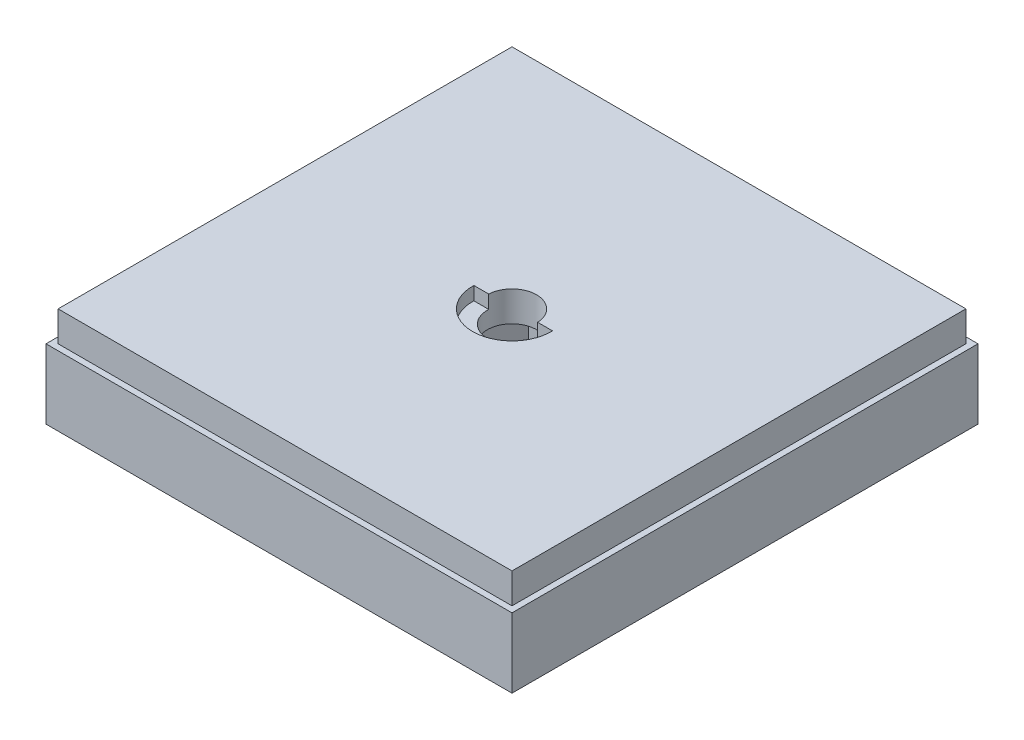
ISO-10303-21;
HEADER;
FILE_DESCRIPTION(('STEP AP214'),'2;1');
FILE_NAME('part.step','',(''),(''),'','','');
FILE_SCHEMA(('AUTOMOTIVE_DESIGN { 1 0 10303 214 1 1 1 1 }'));
ENDSEC;
DATA;
#1=APPLICATION_CONTEXT('core data for automotive mechanical design processes');
#2=APPLICATION_PROTOCOL_DEFINITION('international standard','automotive_design',2000,#1);
#3=PRODUCT_CONTEXT('',#1,'mechanical');
#4=PRODUCT('Part','Part','',(#3));
#5=PRODUCT_RELATED_PRODUCT_CATEGORY('part','',(#4));
#6=PRODUCT_DEFINITION_FORMATION('','',#4);
#7=PRODUCT_DEFINITION_CONTEXT('part definition',#1,'design');
#8=PRODUCT_DEFINITION('design','',#6,#7);
#9=PRODUCT_DEFINITION_SHAPE('','',#8);
#10=(LENGTH_UNIT() NAMED_UNIT(*) SI_UNIT(.MILLI.,.METRE.));
#11=(NAMED_UNIT(*) PLANE_ANGLE_UNIT() SI_UNIT($,.RADIAN.));
#12=(NAMED_UNIT(*) SI_UNIT($,.STERADIAN.) SOLID_ANGLE_UNIT());
#13=UNCERTAINTY_MEASURE_WITH_UNIT(LENGTH_MEASURE(1.E-05),#10,'distance_accuracy_value','');
#14=(GEOMETRIC_REPRESENTATION_CONTEXT(3) GLOBAL_UNCERTAINTY_ASSIGNED_CONTEXT((#13)) GLOBAL_UNIT_ASSIGNED_CONTEXT((#10,
#11,#12)) REPRESENTATION_CONTEXT('',''));
#15=CARTESIAN_POINT('',(0.,0.,0.));
#16=DIRECTION('',(0.,0.,1.));
#17=DIRECTION('',(1.,0.,0.));
#18=AXIS2_PLACEMENT_3D('',#15,#16,#17);
#19=CARTESIAN_POINT('',(-34.7472232502674,11.5,-32.));
#20=DIRECTION('',(-0.866025403784439,0.,-0.5));
#21=DIRECTION('',(-0.5,0.,0.866025403784439));
#22=AXIS2_PLACEMENT_3D('',#19,#20,#21);
#23=PLANE('',#22);
#24=DIRECTION('',(0.,-1.,0.));
#25=VECTOR('',#24,1.);
#26=CARTESIAN_POINT('',(-30.9944465005349,11.5,-38.5));
#27=LINE('',#26,#25);
#28=CARTESIAN_POINT('',(-30.9944465005349,11.5,-38.5));
#29=VERTEX_POINT('',#28);
#30=CARTESIAN_POINT('',(-30.9944465005349,7.,-38.5));
#31=VERTEX_POINT('',#30);
#32=EDGE_CURVE('E320',#29,#31,#27,.T.);
#33=ORIENTED_EDGE('',*,*,#32,.T.);
#34=DIRECTION('',(-0.5,0.,0.866025403784439));
#35=VECTOR('',#34,1.);
#36=CARTESIAN_POINT('',(-34.7472232502674,7.,-32.));
#37=LINE('',#36,#35);
#38=CARTESIAN_POINT('',(-34.7472232502674,7.,-32.));
#39=VERTEX_POINT('',#38);
#40=EDGE_CURVE('E219',#31,#39,#37,.T.);
#41=ORIENTED_EDGE('',*,*,#40,.T.);
#42=DIRECTION('',(0.,-1.,0.));
#43=VECTOR('',#42,1.);
#44=CARTESIAN_POINT('',(-34.7472232502674,11.5,-32.));
#45=LINE('',#44,#43);
#46=CARTESIAN_POINT('',(-34.7472232502674,11.5,-32.));
#47=VERTEX_POINT('',#46);
#48=EDGE_CURVE('E300',#47,#39,#45,.T.);
#49=ORIENTED_EDGE('',*,*,#48,.F.);
#50=DIRECTION('',(0.5,0.,-0.866025403784439));
#51=VECTOR('',#50,1.);
#52=CARTESIAN_POINT('',(-34.7472232502674,11.5,-32.));
#53=LINE('',#52,#51);
#54=EDGE_CURVE('E276',#47,#29,#53,.T.);
#55=ORIENTED_EDGE('',*,*,#54,.T.);
#56=EDGE_LOOP('',(#33,#41,#49,#55));
#57=FACE_BOUND('',#56,.T.);
#58=ADVANCED_FACE('F39',(#57),#23,.T.);
#59=CARTESIAN_POINT('',(-30.9944465005349,11.5,-38.5));
#60=DIRECTION('',(-0.866025403784439,0.,0.5));
#61=DIRECTION('',(0.5,0.,0.866025403784439));
#62=AXIS2_PLACEMENT_3D('',#59,#60,#61);
#63=PLANE('',#62);
#64=DIRECTION('',(0.,-1.,0.));
#65=VECTOR('',#64,1.);
#66=CARTESIAN_POINT('',(-34.7472232502674,11.5,-45.));
#67=LINE('',#66,#65);
#68=CARTESIAN_POINT('',(-34.7472232502674,11.5,-45.));
#69=VERTEX_POINT('',#68);
#70=CARTESIAN_POINT('',(-34.7472232502674,7.,-45.));
#71=VERTEX_POINT('',#70);
#72=EDGE_CURVE('E316',#69,#71,#67,.T.);
#73=ORIENTED_EDGE('',*,*,#72,.T.);
#74=DIRECTION('',(0.5,0.,0.866025403784439));
#75=VECTOR('',#74,1.);
#76=CARTESIAN_POINT('',(-30.9944465005349,7.,-38.5));
#77=LINE('',#76,#75);
#78=EDGE_CURVE('E215',#71,#31,#77,.T.);
#79=ORIENTED_EDGE('',*,*,#78,.T.);
#80=ORIENTED_EDGE('',*,*,#32,.F.);
#81=DIRECTION('',(-0.5,0.,-0.866025403784439));
#82=VECTOR('',#81,1.);
#83=CARTESIAN_POINT('',(-30.9944465005349,11.5,-38.5));
#84=LINE('',#83,#82);
#85=EDGE_CURVE('E280',#29,#69,#84,.T.);
#86=ORIENTED_EDGE('',*,*,#85,.T.);
#87=EDGE_LOOP('',(#73,#79,#80,#86));
#88=FACE_BOUND('',#87,.T.);
#89=ADVANCED_FACE('F406',(#88),#63,.T.);
#90=CARTESIAN_POINT('',(-34.7472232502674,11.5,-45.));
#91=DIRECTION('',(0.,0.,1.));
#92=DIRECTION('',(1.,0.,0.));
#93=AXIS2_PLACEMENT_3D('',#90,#91,#92);
#94=PLANE('',#93);
#95=DIRECTION('',(0.,-1.,0.));
#96=VECTOR('',#95,1.);
#97=CARTESIAN_POINT('',(-42.2527767497326,11.5,-45.));
#98=LINE('',#97,#96);
#99=CARTESIAN_POINT('',(-42.2527767497326,11.5,-45.));
#100=VERTEX_POINT('',#99);
#101=CARTESIAN_POINT('',(-42.2527767497326,7.,-45.));
#102=VERTEX_POINT('',#101);
#103=EDGE_CURVE('E312',#100,#102,#98,.T.);
#104=ORIENTED_EDGE('',*,*,#103,.T.);
#105=DIRECTION('',(1.,0.,0.));
#106=VECTOR('',#105,1.);
#107=CARTESIAN_POINT('',(-34.7472232502674,7.,-45.));
#108=LINE('',#107,#106);
#109=EDGE_CURVE('E211',#102,#71,#108,.T.);
#110=ORIENTED_EDGE('',*,*,#109,.T.);
#111=ORIENTED_EDGE('',*,*,#72,.F.);
#112=DIRECTION('',(-1.,0.,0.));
#113=VECTOR('',#112,1.);
#114=CARTESIAN_POINT('',(-34.7472232502674,11.5,-45.));
#115=LINE('',#114,#113);
#116=EDGE_CURVE('E284',#69,#100,#115,.T.);
#117=ORIENTED_EDGE('',*,*,#116,.T.);
#118=EDGE_LOOP('',(#104,#110,#111,#117));
#119=FACE_BOUND('',#118,.T.);
#120=ADVANCED_FACE('F412',(#119),#94,.T.);
#121=CARTESIAN_POINT('',(-42.2527767497326,11.5,-45.));
#122=DIRECTION('',(0.866025403784439,0.,0.5));
#123=DIRECTION('',(0.5,0.,-0.866025403784439));
#124=AXIS2_PLACEMENT_3D('',#121,#122,#123);
#125=PLANE('',#124);
#126=DIRECTION('',(0.,-1.,0.));
#127=VECTOR('',#126,1.);
#128=CARTESIAN_POINT('',(-46.0055534994651,11.5,-38.5));
#129=LINE('',#128,#127);
#130=CARTESIAN_POINT('',(-46.0055534994651,11.5,-38.5));
#131=VERTEX_POINT('',#130);
#132=CARTESIAN_POINT('',(-46.0055534994651,7.,-38.5));
#133=VERTEX_POINT('',#132);
#134=EDGE_CURVE('E308',#131,#133,#129,.T.);
#135=ORIENTED_EDGE('',*,*,#134,.T.);
#136=DIRECTION('',(0.5,0.,-0.866025403784439));
#137=VECTOR('',#136,1.);
#138=CARTESIAN_POINT('',(-42.2527767497326,7.,-45.));
#139=LINE('',#138,#137);
#140=EDGE_CURVE('E207',#133,#102,#139,.T.);
#141=ORIENTED_EDGE('',*,*,#140,.T.);
#142=ORIENTED_EDGE('',*,*,#103,.F.);
#143=DIRECTION('',(-0.5,0.,0.866025403784439));
#144=VECTOR('',#143,1.);
#145=CARTESIAN_POINT('',(-42.2527767497326,11.5,-45.));
#146=LINE('',#145,#144);
#147=EDGE_CURVE('E288',#100,#131,#146,.T.);
#148=ORIENTED_EDGE('',*,*,#147,.T.);
#149=EDGE_LOOP('',(#135,#141,#142,#148));
#150=FACE_BOUND('',#149,.T.);
#151=ADVANCED_FACE('F477',(#150),#125,.T.);
#152=CARTESIAN_POINT('',(-46.0055534994651,11.5,-38.5));
#153=DIRECTION('',(0.866025403784439,0.,-0.5));
#154=DIRECTION('',(-0.5,0.,-0.866025403784439));
#155=AXIS2_PLACEMENT_3D('',#152,#153,#154);
#156=PLANE('',#155);
#157=DIRECTION('',(0.,-1.,0.));
#158=VECTOR('',#157,1.);
#159=CARTESIAN_POINT('',(-42.2527767497326,11.5,-32.));
#160=LINE('',#159,#158);
#161=CARTESIAN_POINT('',(-42.2527767497326,11.5,-32.));
#162=VERTEX_POINT('',#161);
#163=CARTESIAN_POINT('',(-42.2527767497326,7.,-32.));
#164=VERTEX_POINT('',#163);
#165=EDGE_CURVE('E304',#162,#164,#160,.T.);
#166=ORIENTED_EDGE('',*,*,#165,.T.);
#167=DIRECTION('',(-0.5,0.,-0.866025403784439));
#168=VECTOR('',#167,1.);
#169=CARTESIAN_POINT('',(-46.0055534994651,7.,-38.5));
#170=LINE('',#169,#168);
#171=EDGE_CURVE('E62',#164,#133,#170,.T.);
#172=ORIENTED_EDGE('',*,*,#171,.T.);
#173=ORIENTED_EDGE('',*,*,#134,.F.);
#174=DIRECTION('',(0.5,0.,0.866025403784439));
#175=VECTOR('',#174,1.);
#176=CARTESIAN_POINT('',(-46.0055534994651,11.5,-38.5));
#177=LINE('',#176,#175);
#178=EDGE_CURVE('E292',#131,#162,#177,.T.);
#179=ORIENTED_EDGE('',*,*,#178,.T.);
#180=EDGE_LOOP('',(#166,#172,#173,#179));
#181=FACE_BOUND('',#180,.T.);
#182=ADVANCED_FACE('F469',(#181),#156,.T.);
#183=CARTESIAN_POINT('',(-42.2527767497326,11.5,-32.));
#184=DIRECTION('',(0.,0.,-1.));
#185=DIRECTION('',(-1.,0.,0.));
#186=AXIS2_PLACEMENT_3D('',#183,#184,#185);
#187=PLANE('',#186);
#188=ORIENTED_EDGE('',*,*,#48,.T.);
#189=DIRECTION('',(-1.,0.,0.));
#190=VECTOR('',#189,1.);
#191=CARTESIAN_POINT('',(-42.2527767497326,7.,-32.));
#192=LINE('',#191,#190);
#193=EDGE_CURVE('E366',#39,#164,#192,.T.);
#194=ORIENTED_EDGE('',*,*,#193,.T.);
#195=ORIENTED_EDGE('',*,*,#165,.F.);
#196=DIRECTION('',(1.,0.,0.));
#197=VECTOR('',#196,1.);
#198=CARTESIAN_POINT('',(-42.2527767497326,11.5,-32.));
#199=LINE('',#198,#197);
#200=EDGE_CURVE('E296',#162,#47,#199,.T.);
#201=ORIENTED_EDGE('',*,*,#200,.T.);
#202=EDGE_LOOP('',(#188,#194,#195,#201));
#203=FACE_BOUND('',#202,.T.);
#204=ADVANCED_FACE('F421',(#203),#187,.T.);
#205=CARTESIAN_POINT('',(0.,11.5,0.));
#206=DIRECTION('',(0.,1.,0.));
#207=DIRECTION('',(0.,0.,1.));
#208=AXIS2_PLACEMENT_3D('',#205,#206,#207);
#209=PLANE('',#208);
#210=DIRECTION('',(-1.,0.,0.));
#211=VECTOR('',#210,1.);
#212=CARTESIAN_POINT('',(-1.,11.5,-76.));
#213=LINE('',#212,#211);
#214=CARTESIAN_POINT('',(-1.,11.5,-76.));
#215=VERTEX_POINT('',#214);
#216=CARTESIAN_POINT('',(-76.,11.5,-76.));
#217=VERTEX_POINT('',#216);
#218=EDGE_CURVE('E228',#215,#217,#213,.T.);
#219=ORIENTED_EDGE('',*,*,#218,.F.);
#220=DIRECTION('',(0.,0.,-1.));
#221=VECTOR('',#220,1.);
#222=CARTESIAN_POINT('',(-1.,11.5,-1.));
#223=LINE('',#222,#221);
#224=CARTESIAN_POINT('',(-1.,11.5,-1.));
#225=VERTEX_POINT('',#224);
#226=EDGE_CURVE('E237',#225,#215,#223,.T.);
#227=ORIENTED_EDGE('',*,*,#226,.F.);
#228=DIRECTION('',(1.,0.,0.));
#229=VECTOR('',#228,1.);
#230=CARTESIAN_POINT('',(-76.,11.5,-1.));
#231=LINE('',#230,#229);
#232=CARTESIAN_POINT('',(-76.,11.5,-1.));
#233=VERTEX_POINT('',#232);
#234=EDGE_CURVE('E254',#233,#225,#231,.T.);
#235=ORIENTED_EDGE('',*,*,#234,.F.);
#236=DIRECTION('',(0.,0.,1.));
#237=VECTOR('',#236,1.);
#238=CARTESIAN_POINT('',(-76.,11.5,-76.));
#239=LINE('',#238,#237);
#240=EDGE_CURVE('E250',#217,#233,#239,.T.);
#241=ORIENTED_EDGE('',*,*,#240,.F.);
#242=EDGE_LOOP('',(#219,#227,#235,#241));
#243=FACE_BOUND('',#242,.T.);
#244=DIRECTION('',(0.,0.,1.));
#245=VECTOR('',#244,1.);
#246=CARTESIAN_POINT('',(-77.,11.5,-77.));
#247=LINE('',#246,#245);
#248=CARTESIAN_POINT('',(-77.,11.5,-77.));
#249=VERTEX_POINT('',#248);
#250=CARTESIAN_POINT('',(-77.,11.5,0.));
#251=VERTEX_POINT('',#250);
#252=EDGE_CURVE('E325',#249,#251,#247,.T.);
#253=ORIENTED_EDGE('',*,*,#252,.T.);
#254=DIRECTION('',(1.,0.,0.));
#255=VECTOR('',#254,1.);
#256=CARTESIAN_POINT('',(-77.,11.5,0.));
#257=LINE('',#256,#255);
#258=CARTESIAN_POINT('',(0.,11.5,0.));
#259=VERTEX_POINT('',#258);
#260=EDGE_CURVE('E329',#251,#259,#257,.T.);
#261=ORIENTED_EDGE('',*,*,#260,.T.);
#262=DIRECTION('',(0.,0.,-1.));
#263=VECTOR('',#262,1.);
#264=CARTESIAN_POINT('',(0.,11.5,-77.));
#265=LINE('',#264,#263);
#266=CARTESIAN_POINT('',(0.,11.5,-77.));
#267=VERTEX_POINT('',#266);
#268=EDGE_CURVE('E333',#259,#267,#265,.T.);
#269=ORIENTED_EDGE('',*,*,#268,.T.);
#270=DIRECTION('',(-1.,0.,0.));
#271=VECTOR('',#270,1.);
#272=CARTESIAN_POINT('',(-77.,11.5,-77.));
#273=LINE('',#272,#271);
#274=EDGE_CURVE('E336',#267,#249,#273,.T.);
#275=ORIENTED_EDGE('',*,*,#274,.T.);
#276=EDGE_LOOP('',(#253,#261,#269,#275));
#277=FACE_BOUND('',#276,.T.);
#278=ADVANCED_FACE('F417',(#243,#277),#209,.T.);
#279=CARTESIAN_POINT('',(0.,0.,0.));
#280=DIRECTION('',(0.,1.,0.));
#281=DIRECTION('',(0.,0.,1.));
#282=AXIS2_PLACEMENT_3D('',#279,#280,#281);
#283=PLANE('',#282);
#284=CARTESIAN_POINT('',(-38.5,0.,-38.5));
#285=DIRECTION('',(0.,-1.,0.));
#286=DIRECTION('',(0.,0.,-1.));
#287=AXIS2_PLACEMENT_3D('',#284,#285,#286);
#288=CIRCLE('',#287,8.);
#289=CARTESIAN_POINT('',(-38.5,0.,-46.5));
#290=VERTEX_POINT('',#289);
#291=EDGE_CURVE('E196',#290,#290,#288,.T.);
#292=ORIENTED_EDGE('',*,*,#291,.F.);
#293=EDGE_LOOP('',(#292));
#294=FACE_BOUND('',#293,.T.);
#295=DIRECTION('',(0.,0.,1.));
#296=VECTOR('',#295,1.);
#297=CARTESIAN_POINT('',(-77.,0.,-77.));
#298=LINE('',#297,#296);
#299=CARTESIAN_POINT('',(-77.,0.,-77.));
#300=VERTEX_POINT('',#299);
#301=CARTESIAN_POINT('',(-77.,0.,0.));
#302=VERTEX_POINT('',#301);
#303=EDGE_CURVE('E324',#300,#302,#298,.T.);
#304=ORIENTED_EDGE('',*,*,#303,.F.);
#305=DIRECTION('',(-1.,0.,0.));
#306=VECTOR('',#305,1.);
#307=CARTESIAN_POINT('',(-77.,0.,-77.));
#308=LINE('',#307,#306);
#309=CARTESIAN_POINT('',(0.,0.,-77.));
#310=VERTEX_POINT('',#309);
#311=EDGE_CURVE('E330',#310,#300,#308,.T.);
#312=ORIENTED_EDGE('',*,*,#311,.F.);
#313=DIRECTION('',(0.,0.,-1.));
#314=VECTOR('',#313,1.);
#315=CARTESIAN_POINT('',(0.,0.,-77.));
#316=LINE('',#315,#314);
#317=CARTESIAN_POINT('',(0.,0.,0.));
#318=VERTEX_POINT('',#317);
#319=EDGE_CURVE('E346',#318,#310,#316,.T.);
#320=ORIENTED_EDGE('',*,*,#319,.F.);
#321=DIRECTION('',(1.,0.,0.));
#322=VECTOR('',#321,1.);
#323=CARTESIAN_POINT('',(-77.,0.,0.));
#324=LINE('',#323,#322);
#325=EDGE_CURVE('E343',#302,#318,#324,.T.);
#326=ORIENTED_EDGE('',*,*,#325,.F.);
#327=EDGE_LOOP('',(#304,#312,#320,#326));
#328=FACE_BOUND('',#327,.T.);
#329=ADVANCED_FACE('F420',(#294,#328),#283,.F.);
#330=CARTESIAN_POINT('',(-77.,11.5,-77.));
#331=DIRECTION('',(1.,0.,0.));
#332=DIRECTION('',(0.,0.,-1.));
#333=AXIS2_PLACEMENT_3D('',#330,#331,#332);
#334=PLANE('',#333);
#335=ORIENTED_EDGE('',*,*,#303,.T.);
#336=DIRECTION('',(0.,-1.,0.));
#337=VECTOR('',#336,1.);
#338=CARTESIAN_POINT('',(-77.,11.5,0.));
#339=LINE('',#338,#337);
#340=EDGE_CURVE('E362',#251,#302,#339,.T.);
#341=ORIENTED_EDGE('',*,*,#340,.F.);
#342=ORIENTED_EDGE('',*,*,#252,.F.);
#343=DIRECTION('',(0.,-1.,0.));
#344=VECTOR('',#343,1.);
#345=CARTESIAN_POINT('',(-77.,11.5,-77.));
#346=LINE('',#345,#344);
#347=EDGE_CURVE('E339',#249,#300,#346,.T.);
#348=ORIENTED_EDGE('',*,*,#347,.T.);
#349=EDGE_LOOP('',(#335,#341,#342,#348));
#350=FACE_BOUND('',#349,.T.);
#351=ADVANCED_FACE('F41',(#350),#334,.F.);
#352=CARTESIAN_POINT('',(-77.,11.5,0.));
#353=DIRECTION('',(0.,0.,-1.));
#354=DIRECTION('',(-1.,0.,0.));
#355=AXIS2_PLACEMENT_3D('',#352,#353,#354);
#356=PLANE('',#355);
#357=ORIENTED_EDGE('',*,*,#325,.T.);
#358=DIRECTION('',(0.,-1.,0.));
#359=VECTOR('',#358,1.);
#360=CARTESIAN_POINT('',(0.,11.5,0.));
#361=LINE('',#360,#359);
#362=EDGE_CURVE('E358',#259,#318,#361,.T.);
#363=ORIENTED_EDGE('',*,*,#362,.F.);
#364=ORIENTED_EDGE('',*,*,#260,.F.);
#365=ORIENTED_EDGE('',*,*,#340,.T.);
#366=EDGE_LOOP('',(#357,#363,#364,#365));
#367=FACE_BOUND('',#366,.T.);
#368=ADVANCED_FACE('F431',(#367),#356,.F.);
#369=CARTESIAN_POINT('',(0.,11.5,-77.));
#370=DIRECTION('',(-1.,0.,0.));
#371=DIRECTION('',(0.,0.,1.));
#372=AXIS2_PLACEMENT_3D('',#369,#370,#371);
#373=PLANE('',#372);
#374=ORIENTED_EDGE('',*,*,#319,.T.);
#375=DIRECTION('',(0.,-1.,0.));
#376=VECTOR('',#375,1.);
#377=CARTESIAN_POINT('',(0.,11.5,-77.));
#378=LINE('',#377,#376);
#379=EDGE_CURVE('E354',#267,#310,#378,.T.);
#380=ORIENTED_EDGE('',*,*,#379,.F.);
#381=ORIENTED_EDGE('',*,*,#268,.F.);
#382=ORIENTED_EDGE('',*,*,#362,.T.);
#383=EDGE_LOOP('',(#374,#380,#381,#382));
#384=FACE_BOUND('',#383,.T.);
#385=ADVANCED_FACE('F428',(#384),#373,.F.);
#386=CARTESIAN_POINT('',(-77.,11.5,-77.));
#387=DIRECTION('',(0.,0.,1.));
#388=DIRECTION('',(1.,0.,0.));
#389=AXIS2_PLACEMENT_3D('',#386,#387,#388);
#390=PLANE('',#389);
#391=ORIENTED_EDGE('',*,*,#311,.T.);
#392=ORIENTED_EDGE('',*,*,#347,.F.);
#393=ORIENTED_EDGE('',*,*,#274,.F.);
#394=ORIENTED_EDGE('',*,*,#379,.T.);
#395=EDGE_LOOP('',(#391,#392,#393,#394));
#396=FACE_BOUND('',#395,.T.);
#397=ADVANCED_FACE('F402',(#396),#390,.F.);
#398=CARTESIAN_POINT('',(0.,16.5,0.));
#399=DIRECTION('',(0.,1.,0.));
#400=DIRECTION('',(0.,0.,1.));
#401=AXIS2_PLACEMENT_3D('',#398,#399,#400);
#402=PLANE('',#401);
#403=DIRECTION('',(-1.,0.,0.));
#404=VECTOR('',#403,1.);
#405=CARTESIAN_POINT('',(-44.9969223483123,16.5,-38.7));
#406=LINE('',#405,#404);
#407=CARTESIAN_POINT('',(-32.0030776516877,16.5,-38.7));
#408=VERTEX_POINT('',#407);
#409=CARTESIAN_POINT('',(-34.4549412859638,16.5,-38.7));
#410=VERTEX_POINT('',#409);
#411=EDGE_CURVE('E181',#408,#410,#406,.T.);
#412=ORIENTED_EDGE('',*,*,#411,.F.);
#413=CARTESIAN_POINT('',(-38.5,16.5,-38.5));
#414=DIRECTION('',(0.,1.,0.));
#415=DIRECTION('',(0.,0.,1.));
#416=AXIS2_PLACEMENT_3D('',#413,#414,#415);
#417=CIRCLE('',#416,6.49999999999999);
#418=CARTESIAN_POINT('',(-44.9969223483123,16.5,-38.7));
#419=VERTEX_POINT('',#418);
#420=EDGE_CURVE('E170',#419,#408,#417,.T.);
#421=ORIENTED_EDGE('',*,*,#420,.F.);
#422=CARTESIAN_POINT('',(-42.5450587140362,16.5,-38.7));
#423=VERTEX_POINT('',#422);
#424=EDGE_CURVE('E192',#423,#419,#406,.T.);
#425=ORIENTED_EDGE('',*,*,#424,.F.);
#426=CARTESIAN_POINT('',(-38.5,16.5,-38.5));
#427=DIRECTION('',(0.,1.,0.));
#428=DIRECTION('',(0.,0.,1.));
#429=AXIS2_PLACEMENT_3D('',#426,#427,#428);
#430=CIRCLE('',#429,4.05);
#431=EDGE_CURVE('E224',#410,#423,#430,.T.);
#432=ORIENTED_EDGE('',*,*,#431,.F.);
#433=EDGE_LOOP('',(#412,#421,#425,#432));
#434=FACE_BOUND('',#433,.T.);
#435=DIRECTION('',(-1.,0.,0.));
#436=VECTOR('',#435,1.);
#437=CARTESIAN_POINT('',(-1.,16.5,-76.));
#438=LINE('',#437,#436);
#439=CARTESIAN_POINT('',(-1.,16.5,-76.));
#440=VERTEX_POINT('',#439);
#441=CARTESIAN_POINT('',(-76.,16.5,-76.));
#442=VERTEX_POINT('',#441);
#443=EDGE_CURVE('E232',#440,#442,#438,.T.);
#444=ORIENTED_EDGE('',*,*,#443,.T.);
#445=DIRECTION('',(0.,0.,1.));
#446=VECTOR('',#445,1.);
#447=CARTESIAN_POINT('',(-76.,16.5,-76.));
#448=LINE('',#447,#446);
#449=CARTESIAN_POINT('',(-76.,16.5,-1.));
#450=VERTEX_POINT('',#449);
#451=EDGE_CURVE('E236',#442,#450,#448,.T.);
#452=ORIENTED_EDGE('',*,*,#451,.T.);
#453=DIRECTION('',(1.,0.,0.));
#454=VECTOR('',#453,1.);
#455=CARTESIAN_POINT('',(-76.,16.5,-1.));
#456=LINE('',#455,#454);
#457=CARTESIAN_POINT('',(-1.,16.5,-1.));
#458=VERTEX_POINT('',#457);
#459=EDGE_CURVE('E240',#450,#458,#456,.T.);
#460=ORIENTED_EDGE('',*,*,#459,.T.);
#461=DIRECTION('',(0.,0.,-1.));
#462=VECTOR('',#461,1.);
#463=CARTESIAN_POINT('',(-1.,16.5,-1.));
#464=LINE('',#463,#462);
#465=EDGE_CURVE('E243',#458,#440,#464,.T.);
#466=ORIENTED_EDGE('',*,*,#465,.T.);
#467=EDGE_LOOP('',(#444,#452,#460,#466));
#468=FACE_BOUND('',#467,.T.);
#469=ADVANCED_FACE('F379',(#434,#468),#402,.T.);
#470=CARTESIAN_POINT('',(0.,11.5,0.));
#471=DIRECTION('',(0.,1.,0.));
#472=DIRECTION('',(0.,0.,1.));
#473=AXIS2_PLACEMENT_3D('',#470,#471,#472);
#474=PLANE('',#473);
#475=ORIENTED_EDGE('',*,*,#85,.F.);
#476=ORIENTED_EDGE('',*,*,#54,.F.);
#477=ORIENTED_EDGE('',*,*,#200,.F.);
#478=ORIENTED_EDGE('',*,*,#178,.F.);
#479=ORIENTED_EDGE('',*,*,#147,.F.);
#480=ORIENTED_EDGE('',*,*,#116,.F.);
#481=EDGE_LOOP('',(#475,#476,#477,#478,#479,#480));
#482=FACE_BOUND('',#481,.T.);
#483=CARTESIAN_POINT('',(-38.5,11.5,-38.5));
#484=DIRECTION('',(0.,1.,0.));
#485=DIRECTION('',(0.,0.,1.));
#486=AXIS2_PLACEMENT_3D('',#483,#484,#485);
#487=CIRCLE('',#486,4.05);
#488=CARTESIAN_POINT('',(-38.5,11.5,-34.45));
#489=VERTEX_POINT('',#488);
#490=EDGE_CURVE('E223',#489,#489,#487,.T.);
#491=ORIENTED_EDGE('',*,*,#490,.T.);
#492=EDGE_LOOP('',(#491));
#493=FACE_BOUND('',#492,.T.);
#494=ADVANCED_FACE('F390',(#482,#493),#474,.F.);
#495=CARTESIAN_POINT('',(-1.,16.5,-76.));
#496=DIRECTION('',(0.,0.,1.));
#497=DIRECTION('',(1.,0.,0.));
#498=AXIS2_PLACEMENT_3D('',#495,#496,#497);
#499=PLANE('',#498);
#500=ORIENTED_EDGE('',*,*,#218,.T.);
#501=DIRECTION('',(0.,-1.,0.));
#502=VECTOR('',#501,1.);
#503=CARTESIAN_POINT('',(-76.,16.5,-76.));
#504=LINE('',#503,#502);
#505=EDGE_CURVE('E272',#442,#217,#504,.T.);
#506=ORIENTED_EDGE('',*,*,#505,.F.);
#507=ORIENTED_EDGE('',*,*,#443,.F.);
#508=DIRECTION('',(0.,-1.,0.));
#509=VECTOR('',#508,1.);
#510=CARTESIAN_POINT('',(-1.,16.5,-76.));
#511=LINE('',#510,#509);
#512=EDGE_CURVE('E246',#440,#215,#511,.T.);
#513=ORIENTED_EDGE('',*,*,#512,.T.);
#514=EDGE_LOOP('',(#500,#506,#507,#513));
#515=FACE_BOUND('',#514,.T.);
#516=ADVANCED_FACE('F392',(#515),#499,.F.);
#517=CARTESIAN_POINT('',(-76.,16.5,-76.));
#518=DIRECTION('',(1.,0.,0.));
#519=DIRECTION('',(0.,0.,-1.));
#520=AXIS2_PLACEMENT_3D('',#517,#518,#519);
#521=PLANE('',#520);
#522=ORIENTED_EDGE('',*,*,#240,.T.);
#523=DIRECTION('',(0.,-1.,0.));
#524=VECTOR('',#523,1.);
#525=CARTESIAN_POINT('',(-76.,16.5,-1.));
#526=LINE('',#525,#524);
#527=EDGE_CURVE('E268',#450,#233,#526,.T.);
#528=ORIENTED_EDGE('',*,*,#527,.F.);
#529=ORIENTED_EDGE('',*,*,#451,.F.);
#530=ORIENTED_EDGE('',*,*,#505,.T.);
#531=EDGE_LOOP('',(#522,#528,#529,#530));
#532=FACE_BOUND('',#531,.T.);
#533=ADVANCED_FACE('F399',(#532),#521,.F.);
#534=CARTESIAN_POINT('',(-76.,16.5,-1.));
#535=DIRECTION('',(0.,0.,-1.));
#536=DIRECTION('',(-1.,0.,0.));
#537=AXIS2_PLACEMENT_3D('',#534,#535,#536);
#538=PLANE('',#537);
#539=ORIENTED_EDGE('',*,*,#234,.T.);
#540=DIRECTION('',(0.,-1.,0.));
#541=VECTOR('',#540,1.);
#542=CARTESIAN_POINT('',(-1.,16.5,-1.));
#543=LINE('',#542,#541);
#544=EDGE_CURVE('E264',#458,#225,#543,.T.);
#545=ORIENTED_EDGE('',*,*,#544,.F.);
#546=ORIENTED_EDGE('',*,*,#459,.F.);
#547=ORIENTED_EDGE('',*,*,#527,.T.);
#548=EDGE_LOOP('',(#539,#545,#546,#547));
#549=FACE_BOUND('',#548,.T.);
#550=ADVANCED_FACE('F510',(#549),#538,.F.);
#551=CARTESIAN_POINT('',(-1.,16.5,-1.));
#552=DIRECTION('',(-1.,0.,0.));
#553=DIRECTION('',(0.,0.,1.));
#554=AXIS2_PLACEMENT_3D('',#551,#552,#553);
#555=PLANE('',#554);
#556=ORIENTED_EDGE('',*,*,#226,.T.);
#557=ORIENTED_EDGE('',*,*,#512,.F.);
#558=ORIENTED_EDGE('',*,*,#465,.F.);
#559=ORIENTED_EDGE('',*,*,#544,.T.);
#560=EDGE_LOOP('',(#556,#557,#558,#559));
#561=FACE_BOUND('',#560,.T.);
#562=ADVANCED_FACE('F386',(#561),#555,.F.);
#563=CARTESIAN_POINT('',(-38.5,16.5,-38.5));
#564=DIRECTION('',(0.,-1.,0.));
#565=DIRECTION('',(0.,0.,-1.));
#566=AXIS2_PLACEMENT_3D('',#563,#564,#565);
#567=CYLINDRICAL_SURFACE('',#566,4.05);
#568=DIRECTION('',(0.,-1.,0.));
#569=VECTOR('',#568,1.);
#570=CARTESIAN_POINT('',(-34.4549412859638,16.5,-38.7));
#571=LINE('',#570,#569);
#572=CARTESIAN_POINT('',(-34.4549412859638,14.3,-38.7));
#573=VERTEX_POINT('',#572);
#574=EDGE_CURVE('E11',#410,#573,#571,.T.);
#575=ORIENTED_EDGE('',*,*,#574,.F.);
#576=ORIENTED_EDGE('',*,*,#431,.T.);
#577=DIRECTION('',(0.,-1.,0.));
#578=VECTOR('',#577,1.);
#579=CARTESIAN_POINT('',(-42.5450587140362,16.5,-38.7));
#580=LINE('',#579,#578);
#581=CARTESIAN_POINT('',(-42.5450587140362,14.3,-38.7));
#582=VERTEX_POINT('',#581);
#583=EDGE_CURVE('E48',#582,#423,#580,.F.);
#584=ORIENTED_EDGE('',*,*,#583,.F.);
#585=CARTESIAN_POINT('',(-38.5,14.3,-38.5));
#586=DIRECTION('',(0.,1.,0.));
#587=DIRECTION('',(0.,0.,1.));
#588=AXIS2_PLACEMENT_3D('',#585,#586,#587);
#589=CIRCLE('',#588,4.05);
#590=EDGE_CURVE('E369',#582,#573,#589,.T.);
#591=ORIENTED_EDGE('',*,*,#590,.T.);
#592=EDGE_LOOP('',(#575,#576,#584,#591));
#593=FACE_BOUND('',#592,.T.);
#594=ORIENTED_EDGE('',*,*,#490,.F.);
#595=EDGE_LOOP('',(#594));
#596=FACE_BOUND('',#595,.T.);
#597=ADVANCED_FACE('F382',(#593,#596),#567,.F.);
#598=CARTESIAN_POINT('',(-38.5,7.,-38.5));
#599=DIRECTION('',(0.,-1.,0.));
#600=DIRECTION('',(0.,0.,-1.));
#601=AXIS2_PLACEMENT_3D('',#598,#599,#600);
#602=CYLINDRICAL_SURFACE('',#601,8.);
#603=CARTESIAN_POINT('',(-38.5,7.,-38.5));
#604=DIRECTION('',(0.,-1.,0.));
#605=DIRECTION('',(0.,0.,-1.));
#606=AXIS2_PLACEMENT_3D('',#603,#604,#605);
#607=CIRCLE('',#606,8.);
#608=CARTESIAN_POINT('',(-38.5,7.,-46.5));
#609=VERTEX_POINT('',#608);
#610=EDGE_CURVE('E198',#609,#609,#607,.T.);
#611=ORIENTED_EDGE('',*,*,#610,.F.);
#612=EDGE_LOOP('',(#611));
#613=FACE_BOUND('',#612,.T.);
#614=ORIENTED_EDGE('',*,*,#291,.T.);
#615=EDGE_LOOP('',(#614));
#616=FACE_BOUND('',#615,.T.);
#617=ADVANCED_FACE('F385',(#613,#616),#602,.F.);
#618=CARTESIAN_POINT('',(-38.5,7.,-38.5));
#619=DIRECTION('',(0.,-1.,0.));
#620=DIRECTION('',(0.,0.,-1.));
#621=AXIS2_PLACEMENT_3D('',#618,#619,#620);
#622=PLANE('',#621);
#623=ORIENTED_EDGE('',*,*,#78,.F.);
#624=ORIENTED_EDGE('',*,*,#109,.F.);
#625=ORIENTED_EDGE('',*,*,#140,.F.);
#626=ORIENTED_EDGE('',*,*,#171,.F.);
#627=ORIENTED_EDGE('',*,*,#193,.F.);
#628=ORIENTED_EDGE('',*,*,#40,.F.);
#629=EDGE_LOOP('',(#623,#624,#625,#626,#627,#628));
#630=FACE_BOUND('',#629,.T.);
#631=ORIENTED_EDGE('',*,*,#610,.T.);
#632=EDGE_LOOP('',(#631));
#633=FACE_BOUND('',#632,.T.);
#634=ADVANCED_FACE('F572',(#630,#633),#622,.T.);
#635=CARTESIAN_POINT('',(-44.9969223483123,14.3,-38.7));
#636=DIRECTION('',(0.,0.,-1.));
#637=DIRECTION('',(-1.,0.,0.));
#638=AXIS2_PLACEMENT_3D('',#635,#636,#637);
#639=PLANE('',#638);
#640=ORIENTED_EDGE('',*,*,#574,.T.);
#641=DIRECTION('',(-1.,0.,0.));
#642=VECTOR('',#641,1.);
#643=CARTESIAN_POINT('',(-44.9969223483123,14.3,-38.7));
#644=LINE('',#643,#642);
#645=CARTESIAN_POINT('',(-32.0030776516877,14.3,-38.7));
#646=VERTEX_POINT('',#645);
#647=EDGE_CURVE('E55',#646,#573,#644,.T.);
#648=ORIENTED_EDGE('',*,*,#647,.F.);
#649=DIRECTION('',(0.,1.,0.));
#650=VECTOR('',#649,1.);
#651=CARTESIAN_POINT('',(-32.0030776516877,14.3,-38.7));
#652=LINE('',#651,#650);
#653=EDGE_CURVE('E165',#646,#408,#652,.T.);
#654=ORIENTED_EDGE('',*,*,#653,.T.);
#655=ORIENTED_EDGE('',*,*,#411,.T.);
#656=EDGE_LOOP('',(#640,#648,#654,#655));
#657=FACE_BOUND('',#656,.T.);
#658=ADVANCED_FACE('F183',(#657),#639,.F.);
#659=CARTESIAN_POINT('',(-38.5,14.3,-38.5));
#660=DIRECTION('',(0.,1.,0.));
#661=DIRECTION('',(0.,0.,1.));
#662=AXIS2_PLACEMENT_3D('',#659,#660,#661);
#663=CYLINDRICAL_SURFACE('',#662,6.49999999999999);
#664=ORIENTED_EDGE('',*,*,#420,.T.);
#665=ORIENTED_EDGE('',*,*,#653,.F.);
#666=CARTESIAN_POINT('',(-38.5,14.3,-38.5));
#667=DIRECTION('',(0.,1.,0.));
#668=DIRECTION('',(0.,0.,1.));
#669=AXIS2_PLACEMENT_3D('',#666,#667,#668);
#670=CIRCLE('',#669,6.49999999999999);
#671=CARTESIAN_POINT('',(-44.9969223483123,14.3,-38.7));
#672=VERTEX_POINT('',#671);
#673=EDGE_CURVE('E168',#672,#646,#670,.T.);
#674=ORIENTED_EDGE('',*,*,#673,.F.);
#675=DIRECTION('',(0.,1.,0.));
#676=VECTOR('',#675,1.);
#677=CARTESIAN_POINT('',(-44.9969223483123,14.3,-38.7));
#678=LINE('',#677,#676);
#679=EDGE_CURVE('E174',#672,#419,#678,.T.);
#680=ORIENTED_EDGE('',*,*,#679,.T.);
#681=EDGE_LOOP('',(#664,#665,#674,#680));
#682=FACE_BOUND('',#681,.T.);
#683=ADVANCED_FACE('F166',(#682),#663,.F.);
#684=ORIENTED_EDGE('',*,*,#583,.T.);
#685=ORIENTED_EDGE('',*,*,#424,.T.);
#686=ORIENTED_EDGE('',*,*,#679,.F.);
#687=EDGE_CURVE('E178',#582,#672,#644,.T.);
#688=ORIENTED_EDGE('',*,*,#687,.F.);
#689=EDGE_LOOP('',(#684,#685,#686,#688));
#690=FACE_BOUND('',#689,.T.);
#691=ADVANCED_FACE('F375',(#690),#639,.F.);
#692=CARTESIAN_POINT('',(-38.5,14.3,-38.5));
#693=DIRECTION('',(0.,1.,0.));
#694=DIRECTION('',(0.,0.,1.));
#695=AXIS2_PLACEMENT_3D('',#692,#693,#694);
#696=PLANE('',#695);
#697=ORIENTED_EDGE('',*,*,#687,.T.);
#698=ORIENTED_EDGE('',*,*,#673,.T.);
#699=ORIENTED_EDGE('',*,*,#647,.T.);
#700=ORIENTED_EDGE('',*,*,#590,.F.);
#701=EDGE_LOOP('',(#697,#698,#699,#700));
#702=FACE_BOUND('',#701,.T.);
#703=ADVANCED_FACE('F176',(#702),#696,.T.);
#704=CLOSED_SHELL('',(#58,#89,#120,#151,#182,#204,#278,#329,#351,#368,#385,#397,#469,#494,#516,
#533,#550,#562,#597,#617,#634,#658,#683,#691,#703));
#705=MANIFOLD_SOLID_BREP('B2',#704);
#706=ADVANCED_BREP_SHAPE_REPRESENTATION('',(#18,#705),#14);
#707=SHAPE_DEFINITION_REPRESENTATION(#9,#706);
ENDSEC;
END-ISO-10303-21;
